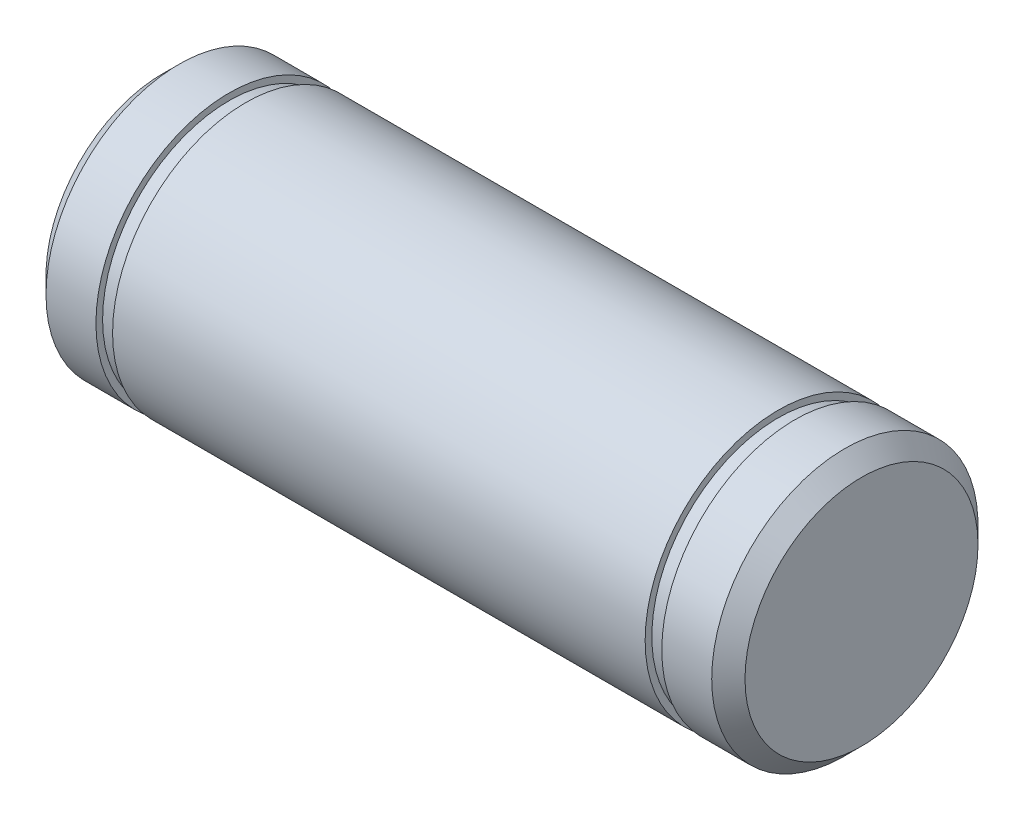
ISO-10303-21;
HEADER;
FILE_DESCRIPTION(('STEP AP214'),'2;1');
FILE_NAME('part.step','',(''),(''),'','','');
FILE_SCHEMA(('AUTOMOTIVE_DESIGN { 1 0 10303 214 1 1 1 1 }'));
ENDSEC;
DATA;
#1=APPLICATION_CONTEXT('core data for automotive mechanical design processes');
#2=APPLICATION_PROTOCOL_DEFINITION('international standard','automotive_design',2000,#1);
#3=PRODUCT_CONTEXT('',#1,'mechanical');
#4=PRODUCT('Part','Part','',(#3));
#5=PRODUCT_RELATED_PRODUCT_CATEGORY('part','',(#4));
#6=PRODUCT_DEFINITION_FORMATION('','',#4);
#7=PRODUCT_DEFINITION_CONTEXT('part definition',#1,'design');
#8=PRODUCT_DEFINITION('design','',#6,#7);
#9=PRODUCT_DEFINITION_SHAPE('','',#8);
#10=(LENGTH_UNIT() NAMED_UNIT(*) SI_UNIT(.MILLI.,.METRE.));
#11=(NAMED_UNIT(*) PLANE_ANGLE_UNIT() SI_UNIT($,.RADIAN.));
#12=(NAMED_UNIT(*) SI_UNIT($,.STERADIAN.) SOLID_ANGLE_UNIT());
#13=UNCERTAINTY_MEASURE_WITH_UNIT(LENGTH_MEASURE(1.E-05),#10,'distance_accuracy_value','');
#14=(GEOMETRIC_REPRESENTATION_CONTEXT(3) GLOBAL_UNCERTAINTY_ASSIGNED_CONTEXT((#13)) GLOBAL_UNIT_ASSIGNED_CONTEXT((#10,
#11,#12)) REPRESENTATION_CONTEXT('',''));
#15=CARTESIAN_POINT('',(0.,0.,0.));
#16=DIRECTION('',(0.,0.,1.));
#17=DIRECTION('',(1.,0.,0.));
#18=AXIS2_PLACEMENT_3D('',#15,#16,#17);
#19=CARTESIAN_POINT('',(10.5,0.,0.));
#20=DIRECTION('',(-1.,0.,0.));
#21=DIRECTION('',(0.,0.,1.));
#22=AXIS2_PLACEMENT_3D('',#19,#20,#21);
#23=CYLINDRICAL_SURFACE('',#22,2.);
#24=CARTESIAN_POINT('',(9.25,0.,0.));
#25=DIRECTION('',(1.,0.,0.));
#26=DIRECTION('',(0.,0.,-1.));
#27=AXIS2_PLACEMENT_3D('',#24,#25,#26);
#28=CIRCLE('',#27,2.);
#29=CARTESIAN_POINT('',(9.25,0.,2.));
#30=VERTEX_POINT('',#29);
#31=EDGE_CURVE('E56',#30,#30,#28,.T.);
#32=CARTESIAN_POINT('',(1.25,0.,0.));
#33=DIRECTION('',(-1.,0.,0.));
#34=DIRECTION('',(0.,0.,1.));
#35=AXIS2_PLACEMENT_3D('',#32,#33,#34);
#36=CIRCLE('',#35,2.);
#37=CARTESIAN_POINT('',(1.25,0.,2.));
#38=VERTEX_POINT('',#37);
#39=EDGE_CURVE('E57',#38,#38,#36,.T.);
#40=CARTESIAN_POINT('',(9.25,0.,2.));
#41=CARTESIAN_POINT('',(9.16666666666667,0.,2.));
#42=CARTESIAN_POINT('',(9.08333333333333,0.,2.));
#43=CARTESIAN_POINT('',(8.91666666666667,0.,2.));
#44=CARTESIAN_POINT('',(8.83333333333333,0.,2.));
#45=CARTESIAN_POINT('',(8.66666666666667,0.,2.));
#46=CARTESIAN_POINT('',(8.58333333333333,0.,2.));
#47=CARTESIAN_POINT('',(8.41666666666667,0.,2.));
#48=CARTESIAN_POINT('',(8.33333333333333,0.,2.));
#49=CARTESIAN_POINT('',(8.16666666666667,0.,2.));
#50=CARTESIAN_POINT('',(8.08333333333333,0.,2.));
#51=CARTESIAN_POINT('',(7.91666666666667,0.,2.));
#52=CARTESIAN_POINT('',(7.83333333333333,0.,2.));
#53=CARTESIAN_POINT('',(7.66666666666667,0.,2.));
#54=CARTESIAN_POINT('',(7.58333333333333,0.,2.));
#55=CARTESIAN_POINT('',(7.41666666666667,0.,2.));
#56=CARTESIAN_POINT('',(7.33333333333333,0.,2.));
#57=CARTESIAN_POINT('',(7.16666666666667,0.,2.));
#58=CARTESIAN_POINT('',(7.08333333333333,0.,2.));
#59=CARTESIAN_POINT('',(6.91666666666667,0.,2.));
#60=CARTESIAN_POINT('',(6.83333333333333,0.,2.));
#61=CARTESIAN_POINT('',(6.66666666666667,0.,2.));
#62=CARTESIAN_POINT('',(6.58333333333333,0.,2.));
#63=CARTESIAN_POINT('',(6.41666666666667,0.,2.));
#64=CARTESIAN_POINT('',(6.33333333333333,0.,2.));
#65=CARTESIAN_POINT('',(6.16666666666667,0.,2.));
#66=CARTESIAN_POINT('',(6.08333333333333,0.,2.));
#67=CARTESIAN_POINT('',(5.91666666666667,0.,2.));
#68=CARTESIAN_POINT('',(5.83333333333333,0.,2.));
#69=CARTESIAN_POINT('',(5.66666666666667,0.,2.));
#70=CARTESIAN_POINT('',(5.58333333333333,0.,2.));
#71=CARTESIAN_POINT('',(5.41666666666667,0.,2.));
#72=CARTESIAN_POINT('',(5.33333333333333,0.,2.));
#73=CARTESIAN_POINT('',(5.16666666666667,0.,2.));
#74=CARTESIAN_POINT('',(5.08333333333333,0.,2.));
#75=CARTESIAN_POINT('',(4.91666666666667,0.,2.));
#76=CARTESIAN_POINT('',(4.83333333333333,0.,2.));
#77=CARTESIAN_POINT('',(4.66666666666667,0.,2.));
#78=CARTESIAN_POINT('',(4.58333333333333,0.,2.));
#79=CARTESIAN_POINT('',(4.41666666666667,0.,2.));
#80=CARTESIAN_POINT('',(4.33333333333333,0.,2.));
#81=CARTESIAN_POINT('',(4.16666666666667,0.,2.));
#82=CARTESIAN_POINT('',(4.08333333333333,0.,2.));
#83=CARTESIAN_POINT('',(3.91666666666667,0.,2.));
#84=CARTESIAN_POINT('',(3.83333333333333,0.,2.));
#85=CARTESIAN_POINT('',(3.66666666666667,0.,2.));
#86=CARTESIAN_POINT('',(3.58333333333333,0.,2.));
#87=CARTESIAN_POINT('',(3.41666666666667,0.,2.));
#88=CARTESIAN_POINT('',(3.33333333333333,0.,2.));
#89=CARTESIAN_POINT('',(3.16666666666667,0.,2.));
#90=CARTESIAN_POINT('',(3.08333333333333,0.,2.));
#91=CARTESIAN_POINT('',(2.91666666666667,0.,2.));
#92=CARTESIAN_POINT('',(2.83333333333333,0.,2.));
#93=CARTESIAN_POINT('',(2.66666666666667,0.,2.));
#94=CARTESIAN_POINT('',(2.58333333333333,0.,2.));
#95=CARTESIAN_POINT('',(2.41666666666667,0.,2.));
#96=CARTESIAN_POINT('',(2.33333333333334,0.,2.));
#97=CARTESIAN_POINT('',(2.16666666666667,0.,2.));
#98=CARTESIAN_POINT('',(2.08333333333334,0.,2.));
#99=CARTESIAN_POINT('',(1.91666666666667,0.,2.));
#100=CARTESIAN_POINT('',(1.83333333333334,0.,2.));
#101=CARTESIAN_POINT('',(1.66666666666667,0.,2.));
#102=CARTESIAN_POINT('',(1.58333333333333,0.,2.));
#103=CARTESIAN_POINT('',(1.41666666666667,0.,2.));
#104=CARTESIAN_POINT('',(1.33333333333333,0.,2.));
#105=CARTESIAN_POINT('',(1.25,0.,2.));
#106=B_SPLINE_CURVE_WITH_KNOTS('',3,(#40,#41,#42,#43,#44,#45,#46,#47,#48,#49,#50,#51,#52,#53,
#54,#55,#56,#57,#58,#59,#60,#61,#62,#63,#64,#65,#66,#67,#68,#69,#70,#71,#72,#73,#74,#75,#76,#77,
#78,#79,#80,#81,#82,#83,#84,#85,#86,#87,#88,#89,#90,#91,#92,#93,#94,#95,#96,#97,#98,#99,#100,
#101,#102,#103,#104,#105),.UNSPECIFIED.,.F.,.F.,(4,2,2,2,2,2,2,2,2,2,2,2,2,2,2,2,2,2,2,2,2,2,2,
2,2,2,2,2,2,2,2,2,4),(0.,0.249999999999999,0.499999999999999,0.749999999999999,
0.999999999999999,1.25,1.5,1.75,2.,2.25,2.5,2.75,3.,3.25,3.5,3.75,4.,4.25,4.5,4.75,5.,5.25,5.5,
5.75,6.,6.25,6.5,6.75,7.,7.25,7.5,7.75,8.),.UNSPECIFIED.);
#107=EDGE_CURVE('BSEAM36',#30,#38,#106,.T.);
#108=ORIENTED_EDGE('',*,*,#31,.F.);
#109=ORIENTED_EDGE('',*,*,#39,.F.);
#110=ORIENTED_EDGE('',*,*,#107,.T.);
#111=ORIENTED_EDGE('',*,*,#107,.F.);
#112=EDGE_LOOP('',(#108,#110,#109,#111));
#113=FACE_BOUND('',#112,.T.);
#114=ADVANCED_FACE('F36',(#113),#23,.T.);
#115=CARTESIAN_POINT('',(9.25,0.,0.));
#116=DIRECTION('',(1.,0.,0.));
#117=DIRECTION('',(0.,0.,-1.));
#118=AXIS2_PLACEMENT_3D('',#115,#116,#117);
#119=PLANE('',#118);
#120=CARTESIAN_POINT('',(9.25,0.,0.));
#121=DIRECTION('',(1.,0.,0.));
#122=DIRECTION('',(0.,0.,-1.));
#123=AXIS2_PLACEMENT_3D('',#120,#121,#122);
#124=CIRCLE('',#123,1.9);
#125=CARTESIAN_POINT('',(9.25,0.,-1.9));
#126=VERTEX_POINT('',#125);
#127=EDGE_CURVE('E70',#126,#126,#124,.T.);
#128=ORIENTED_EDGE('',*,*,#127,.F.);
#129=EDGE_LOOP('',(#128));
#130=FACE_BOUND('',#129,.T.);
#131=ORIENTED_EDGE('',*,*,#31,.T.);
#132=EDGE_LOOP('',(#131));
#133=FACE_BOUND('',#132,.T.);
#134=ADVANCED_FACE('F93',(#130,#133),#119,.T.);
#135=CARTESIAN_POINT('',(9.5,0.,0.));
#136=DIRECTION('',(1.,0.,0.));
#137=DIRECTION('',(0.,0.,-1.));
#138=AXIS2_PLACEMENT_3D('',#135,#136,#137);
#139=PLANE('',#138);
#140=CARTESIAN_POINT('',(9.5,0.,0.));
#141=DIRECTION('',(1.,0.,0.));
#142=DIRECTION('',(0.,0.,-1.));
#143=AXIS2_PLACEMENT_3D('',#140,#141,#142);
#144=CIRCLE('',#143,1.9);
#145=CARTESIAN_POINT('',(9.5,0.,-1.9));
#146=VERTEX_POINT('',#145);
#147=EDGE_CURVE('E60',#146,#146,#144,.T.);
#148=ORIENTED_EDGE('',*,*,#147,.T.);
#149=EDGE_LOOP('',(#148));
#150=FACE_BOUND('',#149,.T.);
#151=CARTESIAN_POINT('',(9.5,0.,0.));
#152=DIRECTION('',(1.,0.,0.));
#153=DIRECTION('',(0.,0.,-1.));
#154=AXIS2_PLACEMENT_3D('',#151,#152,#153);
#155=CIRCLE('',#154,2.);
#156=CARTESIAN_POINT('',(9.5,0.,2.));
#157=VERTEX_POINT('',#156);
#158=EDGE_CURVE('E67',#157,#157,#155,.T.);
#159=ORIENTED_EDGE('',*,*,#158,.F.);
#160=EDGE_LOOP('',(#159));
#161=FACE_BOUND('',#160,.T.);
#162=ADVANCED_FACE('F100',(#150,#161),#139,.F.);
#163=CARTESIAN_POINT('',(9.25,0.,0.));
#164=DIRECTION('',(1.,0.,0.));
#165=DIRECTION('',(0.,0.,-1.));
#166=AXIS2_PLACEMENT_3D('',#163,#164,#165);
#167=CYLINDRICAL_SURFACE('',#166,1.9);
#168=ORIENTED_EDGE('',*,*,#127,.T.);
#169=EDGE_LOOP('',(#168));
#170=FACE_BOUND('',#169,.T.);
#171=ORIENTED_EDGE('',*,*,#147,.F.);
#172=EDGE_LOOP('',(#171));
#173=FACE_BOUND('',#172,.T.);
#174=ADVANCED_FACE('F114',(#170,#173),#167,.T.);
#175=CARTESIAN_POINT('',(10.5,0.,0.));
#176=DIRECTION('',(1.,0.,0.));
#177=DIRECTION('',(0.,0.,-1.));
#178=AXIS2_PLACEMENT_3D('',#175,#176,#177);
#179=PLANE('',#178);
#180=CARTESIAN_POINT('',(10.5,0.,0.));
#181=DIRECTION('',(1.,0.,0.));
#182=DIRECTION('',(0.,0.,-1.));
#183=AXIS2_PLACEMENT_3D('',#180,#181,#182);
#184=CIRCLE('',#183,1.75);
#185=CARTESIAN_POINT('',(10.5,0.,-1.75));
#186=VERTEX_POINT('',#185);
#187=EDGE_CURVE('E43',#186,#186,#184,.T.);
#188=ORIENTED_EDGE('',*,*,#187,.T.);
#189=EDGE_LOOP('',(#188));
#190=FACE_BOUND('',#189,.T.);
#191=ADVANCED_FACE('F110',(#190),#179,.T.);
#192=CARTESIAN_POINT('',(10.25,0.,0.));
#193=DIRECTION('',(1.,0.,0.));
#194=DIRECTION('',(0.,0.,-1.));
#195=AXIS2_PLACEMENT_3D('',#192,#193,#194);
#196=CIRCLE('',#195,2.);
#197=CARTESIAN_POINT('',(10.25,0.,2.));
#198=VERTEX_POINT('',#197);
#199=EDGE_CURVE('E10',#198,#198,#196,.F.);
#200=CARTESIAN_POINT('',(10.25,0.,2.));
#201=CARTESIAN_POINT('',(10.2421875,0.,2.));
#202=CARTESIAN_POINT('',(10.234375,0.,2.));
#203=CARTESIAN_POINT('',(10.21875,0.,2.));
#204=CARTESIAN_POINT('',(10.2109375,0.,2.));
#205=CARTESIAN_POINT('',(10.1953125,0.,2.));
#206=CARTESIAN_POINT('',(10.1875,0.,2.));
#207=CARTESIAN_POINT('',(10.171875,0.,2.));
#208=CARTESIAN_POINT('',(10.1640625,0.,2.));
#209=CARTESIAN_POINT('',(10.1484375,0.,2.));
#210=CARTESIAN_POINT('',(10.140625,0.,2.));
#211=CARTESIAN_POINT('',(10.125,0.,2.));
#212=CARTESIAN_POINT('',(10.1171875,0.,2.));
#213=CARTESIAN_POINT('',(10.1015625,0.,2.));
#214=CARTESIAN_POINT('',(10.09375,0.,2.));
#215=CARTESIAN_POINT('',(10.078125,0.,2.));
#216=CARTESIAN_POINT('',(10.0703125,0.,2.));
#217=CARTESIAN_POINT('',(10.0546875,0.,2.));
#218=CARTESIAN_POINT('',(10.046875,0.,2.));
#219=CARTESIAN_POINT('',(10.03125,0.,2.));
#220=CARTESIAN_POINT('',(10.0234375,0.,2.));
#221=CARTESIAN_POINT('',(10.0078125,0.,2.));
#222=CARTESIAN_POINT('',(10.,0.,2.));
#223=CARTESIAN_POINT('',(9.984375,0.,2.));
#224=CARTESIAN_POINT('',(9.9765625,0.,2.));
#225=CARTESIAN_POINT('',(9.9609375,0.,2.));
#226=CARTESIAN_POINT('',(9.953125,0.,2.));
#227=CARTESIAN_POINT('',(9.9375,0.,2.));
#228=CARTESIAN_POINT('',(9.9296875,0.,2.));
#229=CARTESIAN_POINT('',(9.9140625,0.,2.));
#230=CARTESIAN_POINT('',(9.90625,0.,2.));
#231=CARTESIAN_POINT('',(9.890625,0.,2.));
#232=CARTESIAN_POINT('',(9.8828125,0.,2.));
#233=CARTESIAN_POINT('',(9.8671875,0.,2.));
#234=CARTESIAN_POINT('',(9.859375,0.,2.));
#235=CARTESIAN_POINT('',(9.84375,0.,2.));
#236=CARTESIAN_POINT('',(9.8359375,0.,2.));
#237=CARTESIAN_POINT('',(9.8203125,0.,2.));
#238=CARTESIAN_POINT('',(9.8125,0.,2.));
#239=CARTESIAN_POINT('',(9.796875,0.,2.));
#240=CARTESIAN_POINT('',(9.7890625,0.,2.));
#241=CARTESIAN_POINT('',(9.7734375,0.,2.));
#242=CARTESIAN_POINT('',(9.765625,0.,2.));
#243=CARTESIAN_POINT('',(9.75,0.,2.));
#244=CARTESIAN_POINT('',(9.7421875,0.,2.));
#245=CARTESIAN_POINT('',(9.7265625,0.,2.));
#246=CARTESIAN_POINT('',(9.71875,0.,2.));
#247=CARTESIAN_POINT('',(9.703125,0.,2.));
#248=CARTESIAN_POINT('',(9.6953125,0.,2.));
#249=CARTESIAN_POINT('',(9.6796875,0.,2.));
#250=CARTESIAN_POINT('',(9.671875,0.,2.));
#251=CARTESIAN_POINT('',(9.65625,0.,2.));
#252=CARTESIAN_POINT('',(9.6484375,0.,2.));
#253=CARTESIAN_POINT('',(9.6328125,0.,2.));
#254=CARTESIAN_POINT('',(9.625,0.,2.));
#255=CARTESIAN_POINT('',(9.609375,0.,2.));
#256=CARTESIAN_POINT('',(9.6015625,0.,2.));
#257=CARTESIAN_POINT('',(9.5859375,0.,2.));
#258=CARTESIAN_POINT('',(9.578125,0.,2.));
#259=CARTESIAN_POINT('',(9.5625,0.,2.));
#260=CARTESIAN_POINT('',(9.5546875,0.,2.));
#261=CARTESIAN_POINT('',(9.5390625,0.,2.));
#262=CARTESIAN_POINT('',(9.53125,0.,2.));
#263=CARTESIAN_POINT('',(9.515625,0.,2.));
#264=CARTESIAN_POINT('',(9.5078125,0.,2.));
#265=CARTESIAN_POINT('',(9.5,0.,2.));
#266=B_SPLINE_CURVE_WITH_KNOTS('',3,(#200,#201,#202,#203,#204,#205,#206,#207,#208,#209,#210,
#211,#212,#213,#214,#215,#216,#217,#218,#219,#220,#221,#222,#223,#224,#225,#226,#227,#228,#229,
#230,#231,#232,#233,#234,#235,#236,#237,#238,#239,#240,#241,#242,#243,#244,#245,#246,#247,#248,
#249,#250,#251,#252,#253,#254,#255,#256,#257,#258,#259,#260,#261,#262,#263,#264,#265),
.UNSPECIFIED.,.F.,.F.,(4,2,2,2,2,2,2,2,2,2,2,2,2,2,2,2,2,2,2,2,2,2,2,2,2,2,2,2,2,2,2,2,4),(0.,
0.0234374999999992,0.046875,0.0703124999999992,0.0937500000000001,0.117187499999999,0.140625,
0.164062499999999,0.1875,0.210937499999999,0.234375,0.257812499999999,0.28125,0.304687499999999,
0.328125,0.351562499999999,0.375,0.3984375,0.421875,0.4453125,0.46875,0.4921875,0.515625,
0.5390625,0.5625,0.5859375,0.609375000000001,0.6328125,0.656250000000001,0.6796875,
0.703125000000001,0.7265625,0.750000000000001),.UNSPECIFIED.);
#267=EDGE_CURVE('BSEAM88',#198,#157,#266,.T.);
#268=ORIENTED_EDGE('',*,*,#199,.T.);
#269=ORIENTED_EDGE('',*,*,#158,.T.);
#270=ORIENTED_EDGE('',*,*,#267,.T.);
#271=ORIENTED_EDGE('',*,*,#267,.F.);
#272=EDGE_LOOP('',(#268,#270,#269,#271));
#273=FACE_BOUND('',#272,.T.);
#274=ADVANCED_FACE('F88',(#273),#23,.T.);
#275=CARTESIAN_POINT('',(1.25,0.,0.));
#276=DIRECTION('',(-1.,0.,0.));
#277=DIRECTION('',(0.,0.,1.));
#278=AXIS2_PLACEMENT_3D('',#275,#276,#277);
#279=PLANE('',#278);
#280=CARTESIAN_POINT('',(1.25,0.,0.));
#281=DIRECTION('',(-1.,0.,0.));
#282=DIRECTION('',(0.,0.,1.));
#283=AXIS2_PLACEMENT_3D('',#280,#281,#282);
#284=CIRCLE('',#283,1.9);
#285=CARTESIAN_POINT('',(1.25,0.,1.9));
#286=VERTEX_POINT('',#285);
#287=EDGE_CURVE('E64',#286,#286,#284,.T.);
#288=ORIENTED_EDGE('',*,*,#287,.F.);
#289=EDGE_LOOP('',(#288));
#290=FACE_BOUND('',#289,.T.);
#291=ORIENTED_EDGE('',*,*,#39,.T.);
#292=EDGE_LOOP('',(#291));
#293=FACE_BOUND('',#292,.T.);
#294=ADVANCED_FACE('F84',(#290,#293),#279,.T.);
#295=CARTESIAN_POINT('',(1.,0.,0.));
#296=DIRECTION('',(-1.,0.,0.));
#297=DIRECTION('',(0.,0.,1.));
#298=AXIS2_PLACEMENT_3D('',#295,#296,#297);
#299=PLANE('',#298);
#300=CARTESIAN_POINT('',(1.,0.,0.));
#301=DIRECTION('',(-1.,0.,0.));
#302=DIRECTION('',(0.,0.,1.));
#303=AXIS2_PLACEMENT_3D('',#300,#301,#302);
#304=CIRCLE('',#303,1.9);
#305=CARTESIAN_POINT('',(1.,0.,1.9));
#306=VERTEX_POINT('',#305);
#307=EDGE_CURVE('E75',#306,#306,#304,.T.);
#308=ORIENTED_EDGE('',*,*,#307,.T.);
#309=EDGE_LOOP('',(#308));
#310=FACE_BOUND('',#309,.T.);
#311=CARTESIAN_POINT('',(0.999999999999999,0.,0.));
#312=DIRECTION('',(-1.,0.,0.));
#313=DIRECTION('',(0.,0.,1.));
#314=AXIS2_PLACEMENT_3D('',#311,#312,#313);
#315=CIRCLE('',#314,2.);
#316=CARTESIAN_POINT('',(1.,0.,2.));
#317=VERTEX_POINT('',#316);
#318=EDGE_CURVE('E61',#317,#317,#315,.T.);
#319=ORIENTED_EDGE('',*,*,#318,.F.);
#320=EDGE_LOOP('',(#319));
#321=FACE_BOUND('',#320,.T.);
#322=ADVANCED_FACE('F87',(#310,#321),#299,.F.);
#323=CARTESIAN_POINT('',(1.25,0.,0.));
#324=DIRECTION('',(-1.,0.,0.));
#325=DIRECTION('',(0.,0.,1.));
#326=AXIS2_PLACEMENT_3D('',#323,#324,#325);
#327=CYLINDRICAL_SURFACE('',#326,1.9);
#328=ORIENTED_EDGE('',*,*,#287,.T.);
#329=EDGE_LOOP('',(#328));
#330=FACE_BOUND('',#329,.T.);
#331=ORIENTED_EDGE('',*,*,#307,.F.);
#332=EDGE_LOOP('',(#331));
#333=FACE_BOUND('',#332,.T.);
#334=ADVANCED_FACE('F81',(#330,#333),#327,.T.);
#335=CARTESIAN_POINT('',(0.,0.,0.));
#336=DIRECTION('',(1.,0.,0.));
#337=DIRECTION('',(0.,0.,-1.));
#338=AXIS2_PLACEMENT_3D('',#335,#336,#337);
#339=PLANE('',#338);
#340=CARTESIAN_POINT('',(0.,0.,0.));
#341=DIRECTION('',(1.,0.,0.));
#342=DIRECTION('',(0.,0.,-1.));
#343=AXIS2_PLACEMENT_3D('',#340,#341,#342);
#344=CIRCLE('',#343,1.74999999999999);
#345=CARTESIAN_POINT('',(0.,0.,-1.74999999999999));
#346=VERTEX_POINT('',#345);
#347=EDGE_CURVE('E47',#346,#346,#344,.F.);
#348=ORIENTED_EDGE('',*,*,#347,.T.);
#349=EDGE_LOOP('',(#348));
#350=FACE_BOUND('',#349,.T.);
#351=ADVANCED_FACE('F107',(#350),#339,.F.);
#352=CARTESIAN_POINT('',(0.250000000000011,0.,0.));
#353=DIRECTION('',(1.,0.,0.));
#354=DIRECTION('',(0.,0.,-1.));
#355=AXIS2_PLACEMENT_3D('',#352,#353,#354);
#356=CIRCLE('',#355,2.);
#357=CARTESIAN_POINT('',(0.250000000000011,0.,2.));
#358=VERTEX_POINT('',#357);
#359=EDGE_CURVE('E51',#358,#358,#356,.T.);
#360=CARTESIAN_POINT('',(0.250000000000011,0.,2.));
#361=CARTESIAN_POINT('',(0.25781250000001,0.,2.));
#362=CARTESIAN_POINT('',(0.26562500000001,0.,2.));
#363=CARTESIAN_POINT('',(0.28125000000001,0.,2.));
#364=CARTESIAN_POINT('',(0.28906250000001,0.,2.));
#365=CARTESIAN_POINT('',(0.30468750000001,0.,2.));
#366=CARTESIAN_POINT('',(0.31250000000001,0.,2.));
#367=CARTESIAN_POINT('',(0.32812500000001,0.,2.));
#368=CARTESIAN_POINT('',(0.335937500000009,0.,2.));
#369=CARTESIAN_POINT('',(0.351562500000009,0.,2.));
#370=CARTESIAN_POINT('',(0.35937500000001,0.,2.));
#371=CARTESIAN_POINT('',(0.37500000000001,0.,2.));
#372=CARTESIAN_POINT('',(0.382812500000009,0.,2.));
#373=CARTESIAN_POINT('',(0.398437500000009,0.,2.));
#374=CARTESIAN_POINT('',(0.406250000000008,0.,2.));
#375=CARTESIAN_POINT('',(0.421875000000008,0.,2.));
#376=CARTESIAN_POINT('',(0.429687500000008,0.,2.));
#377=CARTESIAN_POINT('',(0.445312500000008,0.,2.));
#378=CARTESIAN_POINT('',(0.453125000000008,0.,2.));
#379=CARTESIAN_POINT('',(0.468750000000008,0.,2.));
#380=CARTESIAN_POINT('',(0.476562500000008,0.,2.));
#381=CARTESIAN_POINT('',(0.492187500000007,0.,2.));
#382=CARTESIAN_POINT('',(0.500000000000007,0.,2.));
#383=CARTESIAN_POINT('',(0.515625000000007,0.,2.));
#384=CARTESIAN_POINT('',(0.523437500000007,0.,2.));
#385=CARTESIAN_POINT('',(0.539062500000007,0.,2.));
#386=CARTESIAN_POINT('',(0.546875000000007,0.,2.));
#387=CARTESIAN_POINT('',(0.562500000000006,0.,2.));
#388=CARTESIAN_POINT('',(0.570312500000006,0.,2.));
#389=CARTESIAN_POINT('',(0.585937500000006,0.,2.));
#390=CARTESIAN_POINT('',(0.593750000000006,0.,2.));
#391=CARTESIAN_POINT('',(0.609375000000006,0.,2.));
#392=CARTESIAN_POINT('',(0.617187500000006,0.,2.));
#393=CARTESIAN_POINT('',(0.632812500000005,0.,2.));
#394=CARTESIAN_POINT('',(0.640625000000005,0.,2.));
#395=CARTESIAN_POINT('',(0.656250000000005,0.,2.));
#396=CARTESIAN_POINT('',(0.664062500000005,0.,2.));
#397=CARTESIAN_POINT('',(0.679687500000005,0.,2.));
#398=CARTESIAN_POINT('',(0.687500000000005,0.,2.));
#399=CARTESIAN_POINT('',(0.703125000000005,0.,2.));
#400=CARTESIAN_POINT('',(0.710937500000004,0.,2.));
#401=CARTESIAN_POINT('',(0.726562500000004,0.,2.));
#402=CARTESIAN_POINT('',(0.734375000000005,0.,2.));
#403=CARTESIAN_POINT('',(0.750000000000005,0.,2.));
#404=CARTESIAN_POINT('',(0.757812500000004,0.,2.));
#405=CARTESIAN_POINT('',(0.773437500000004,0.,2.));
#406=CARTESIAN_POINT('',(0.781250000000004,0.,2.));
#407=CARTESIAN_POINT('',(0.796875000000004,0.,2.));
#408=CARTESIAN_POINT('',(0.804687500000004,0.,2.));
#409=CARTESIAN_POINT('',(0.820312500000004,0.,2.));
#410=CARTESIAN_POINT('',(0.828125000000004,0.,2.));
#411=CARTESIAN_POINT('',(0.843750000000003,0.,2.));
#412=CARTESIAN_POINT('',(0.851562500000003,0.,2.));
#413=CARTESIAN_POINT('',(0.867187500000002,0.,2.));
#414=CARTESIAN_POINT('',(0.875000000000002,0.,2.));
#415=CARTESIAN_POINT('',(0.890625000000002,0.,2.));
#416=CARTESIAN_POINT('',(0.898437500000002,0.,2.));
#417=CARTESIAN_POINT('',(0.914062500000002,0.,2.));
#418=CARTESIAN_POINT('',(0.921875000000002,0.,2.));
#419=CARTESIAN_POINT('',(0.937500000000001,0.,2.));
#420=CARTESIAN_POINT('',(0.945312500000001,0.,2.));
#421=CARTESIAN_POINT('',(0.960937500000001,0.,2.));
#422=CARTESIAN_POINT('',(0.968750000000001,0.,2.));
#423=CARTESIAN_POINT('',(0.984375000000002,0.,2.));
#424=CARTESIAN_POINT('',(0.992187500000001,0.,2.));
#425=CARTESIAN_POINT('',(1.,0.,2.));
#426=B_SPLINE_CURVE_WITH_KNOTS('',3,(#360,#361,#362,#363,#364,#365,#366,#367,#368,#369,#370,
#371,#372,#373,#374,#375,#376,#377,#378,#379,#380,#381,#382,#383,#384,#385,#386,#387,#388,#389,
#390,#391,#392,#393,#394,#395,#396,#397,#398,#399,#400,#401,#402,#403,#404,#405,#406,#407,#408,
#409,#410,#411,#412,#413,#414,#415,#416,#417,#418,#419,#420,#421,#422,#423,#424,#425),
.UNSPECIFIED.,.F.,.F.,(4,2,2,2,2,2,2,2,2,2,2,2,2,2,2,2,2,2,2,2,2,2,2,2,2,2,2,2,2,2,2,2,4),(0.,
0.0234374999999992,0.046875,0.0703124999999992,0.0937499999999983,0.117187499999999,
0.140624999999998,0.164062499999998,0.187499999999997,0.210937499999998,0.234374999999997,
0.257812499999996,0.281249999999997,0.304687499999996,0.328124999999995,0.351562499999996,
0.374999999999995,0.398437499999994,0.421874999999995,0.445312499999994,0.468749999999993,
0.492187499999994,0.515624999999994,0.539062499999993,0.562499999999994,0.585937499999993,
0.609374999999992,0.632812499999991,0.656249999999992,0.679687499999991,0.70312499999999,
0.726562499999991,0.74999999999999),.UNSPECIFIED.);
#427=EDGE_CURVE('BSEAM96',#358,#317,#426,.T.);
#428=ORIENTED_EDGE('',*,*,#359,.T.);
#429=ORIENTED_EDGE('',*,*,#318,.T.);
#430=ORIENTED_EDGE('',*,*,#427,.T.);
#431=ORIENTED_EDGE('',*,*,#427,.F.);
#432=EDGE_LOOP('',(#428,#430,#429,#431));
#433=FACE_BOUND('',#432,.T.);
#434=ADVANCED_FACE('F96',(#433),#23,.T.);
#435=CARTESIAN_POINT('',(0.250000000000011,0.,0.));
#436=DIRECTION('',(1.,0.,0.));
#437=DIRECTION('',(0.,0.,-1.));
#438=AXIS2_PLACEMENT_3D('',#435,#436,#437);
#439=CONICAL_SURFACE('',#438,2.,0.785398163397451);
#440=ORIENTED_EDGE('',*,*,#347,.F.);
#441=EDGE_LOOP('',(#440));
#442=FACE_BOUND('',#441,.T.);
#443=ORIENTED_EDGE('',*,*,#359,.F.);
#444=EDGE_LOOP('',(#443));
#445=FACE_BOUND('',#444,.T.);
#446=ADVANCED_FACE('F106',(#442,#445),#439,.T.);
#447=CARTESIAN_POINT('',(10.5,0.,0.));
#448=DIRECTION('',(-1.,0.,0.));
#449=DIRECTION('',(0.,0.,1.));
#450=AXIS2_PLACEMENT_3D('',#447,#448,#449);
#451=CONICAL_SURFACE('',#450,1.75,0.785398163397446);
#452=ORIENTED_EDGE('',*,*,#199,.F.);
#453=EDGE_LOOP('',(#452));
#454=FACE_BOUND('',#453,.T.);
#455=ORIENTED_EDGE('',*,*,#187,.F.);
#456=EDGE_LOOP('',(#455));
#457=FACE_BOUND('',#456,.T.);
#458=ADVANCED_FACE('F38',(#454,#457),#451,.T.);
#459=CLOSED_SHELL('',(#114,#134,#162,#174,#191,#274,#294,#322,#334,#351,#434,#446,#458));
#460=MANIFOLD_SOLID_BREP('B2',#459);
#461=ADVANCED_BREP_SHAPE_REPRESENTATION('',(#18,#460),#14);
#462=SHAPE_DEFINITION_REPRESENTATION(#9,#461);
ENDSEC;
END-ISO-10303-21;
